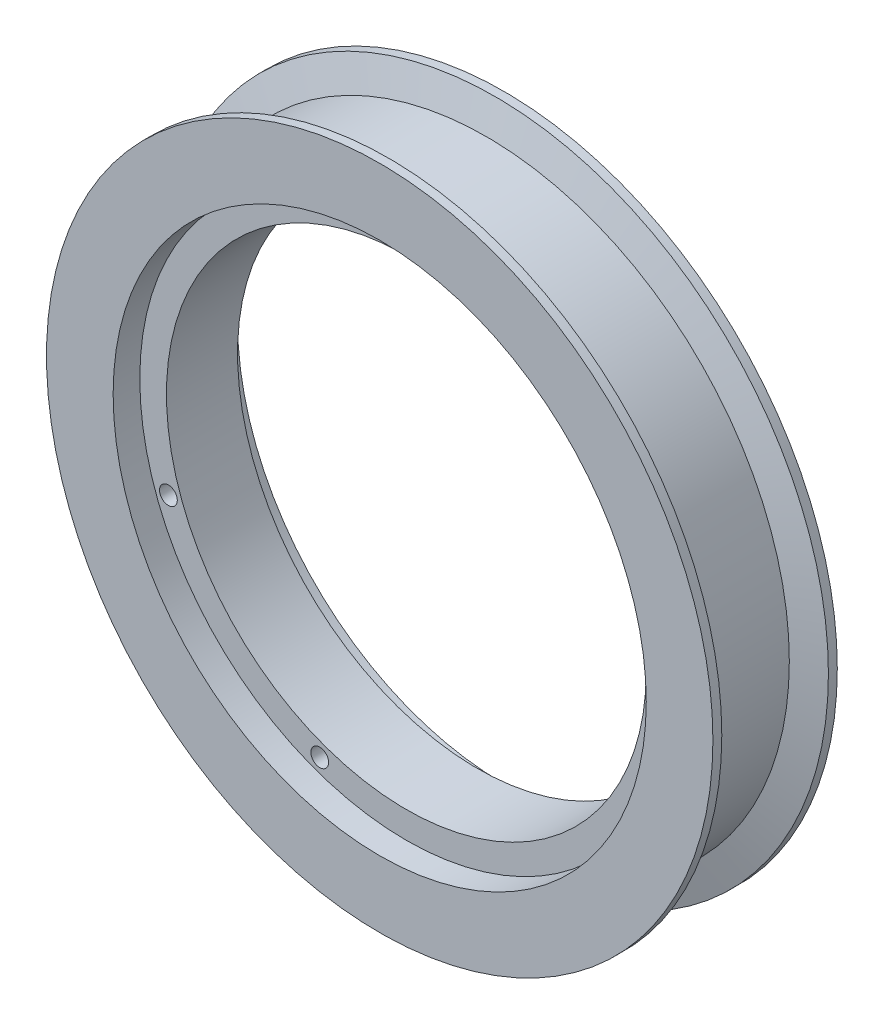
ISO-10303-21;
HEADER;
FILE_DESCRIPTION(('STEP AP214'),'2;1');
FILE_NAME('part.step','',(''),(''),'','','');
FILE_SCHEMA(('AUTOMOTIVE_DESIGN { 1 0 10303 214 1 1 1 1 }'));
ENDSEC;
DATA;
#1=APPLICATION_CONTEXT('core data for automotive mechanical design processes');
#2=APPLICATION_PROTOCOL_DEFINITION('international standard','automotive_design',2000,#1);
#3=PRODUCT_CONTEXT('',#1,'mechanical');
#4=PRODUCT('Part','Part','',(#3));
#5=PRODUCT_RELATED_PRODUCT_CATEGORY('part','',(#4));
#6=PRODUCT_DEFINITION_FORMATION('','',#4);
#7=PRODUCT_DEFINITION_CONTEXT('part definition',#1,'design');
#8=PRODUCT_DEFINITION('design','',#6,#7);
#9=PRODUCT_DEFINITION_SHAPE('','',#8);
#10=(LENGTH_UNIT() NAMED_UNIT(*) SI_UNIT(.MILLI.,.METRE.));
#11=(NAMED_UNIT(*) PLANE_ANGLE_UNIT() SI_UNIT($,.RADIAN.));
#12=(NAMED_UNIT(*) SI_UNIT($,.STERADIAN.) SOLID_ANGLE_UNIT());
#13=UNCERTAINTY_MEASURE_WITH_UNIT(LENGTH_MEASURE(1.E-05),#10,'distance_accuracy_value','');
#14=(GEOMETRIC_REPRESENTATION_CONTEXT(3) GLOBAL_UNCERTAINTY_ASSIGNED_CONTEXT((#13)) GLOBAL_UNIT_ASSIGNED_CONTEXT((#10,
#11,#12)) REPRESENTATION_CONTEXT('',''));
#15=CARTESIAN_POINT('',(0.,0.,0.));
#16=DIRECTION('',(0.,0.,1.));
#17=DIRECTION('',(1.,0.,0.));
#18=AXIS2_PLACEMENT_3D('',#15,#16,#17);
#19=CARTESIAN_POINT('',(0.,0.,25.4));
#20=DIRECTION('',(0.,0.,-1.));
#21=DIRECTION('',(-1.,0.,0.));
#22=AXIS2_PLACEMENT_3D('',#19,#20,#21);
#23=CYLINDRICAL_SURFACE('',#22,95.25);
#24=CARTESIAN_POINT('',(0.,0.,-5.08));
#25=DIRECTION('',(0.,0.,1.));
#26=DIRECTION('',(1.,0.,0.));
#27=AXIS2_PLACEMENT_3D('',#24,#25,#26);
#28=CIRCLE('',#27,95.25);
#29=CARTESIAN_POINT('',(95.25,0.,-5.08));
#30=VERTEX_POINT('',#29);
#31=EDGE_CURVE('E94',#30,#30,#28,.T.);
#32=ORIENTED_EDGE('',*,*,#31,.T.);
#33=EDGE_LOOP('',(#32));
#34=FACE_BOUND('',#33,.T.);
#35=CARTESIAN_POINT('',(0.,0.,-2.54000000000001));
#36=DIRECTION('',(0.,0.,1.));
#37=DIRECTION('',(1.,0.,0.));
#38=AXIS2_PLACEMENT_3D('',#35,#36,#37);
#39=CIRCLE('',#38,95.25);
#40=CARTESIAN_POINT('',(95.25,0.,-2.54000000000001));
#41=VERTEX_POINT('',#40);
#42=EDGE_CURVE('E111',#41,#41,#39,.T.);
#43=ORIENTED_EDGE('',*,*,#42,.F.);
#44=EDGE_LOOP('',(#43));
#45=FACE_BOUND('',#44,.T.);
#46=ADVANCED_FACE('F31',(#34,#45),#23,.T.);
#47=CARTESIAN_POINT('',(0.,0.,30.48));
#48=DIRECTION('',(0.,0.,1.));
#49=DIRECTION('',(1.,0.,0.));
#50=AXIS2_PLACEMENT_3D('',#47,#48,#49);
#51=CIRCLE('',#50,95.25);
#52=CARTESIAN_POINT('',(95.25,0.,30.48));
#53=VERTEX_POINT('',#52);
#54=EDGE_CURVE('E71',#53,#53,#51,.T.);
#55=ORIENTED_EDGE('',*,*,#54,.F.);
#56=EDGE_LOOP('',(#55));
#57=FACE_BOUND('',#56,.T.);
#58=CARTESIAN_POINT('',(0.,0.,27.94));
#59=DIRECTION('',(0.,0.,1.));
#60=DIRECTION('',(1.,0.,0.));
#61=AXIS2_PLACEMENT_3D('',#58,#59,#60);
#62=CIRCLE('',#61,95.25);
#63=CARTESIAN_POINT('',(95.25,0.,27.94));
#64=VERTEX_POINT('',#63);
#65=EDGE_CURVE('E108',#64,#64,#62,.T.);
#66=ORIENTED_EDGE('',*,*,#65,.T.);
#67=EDGE_LOOP('',(#66));
#68=FACE_BOUND('',#67,.T.);
#69=ADVANCED_FACE('F119',(#57,#68),#23,.T.);
#70=CARTESIAN_POINT('',(0.,0.,2.54));
#71=DIRECTION('',(0.,0.,1.));
#72=DIRECTION('',(1.,0.,0.));
#73=AXIS2_PLACEMENT_3D('',#70,#71,#72);
#74=PLANE('',#73);
#75=CARTESIAN_POINT('',(24.7588381753444,68.0243488186899,2.54));
#76=DIRECTION('',(0.,0.,1.));
#77=DIRECTION('',(1.,0.,0.));
#78=AXIS2_PLACEMENT_3D('',#75,#76,#77);
#79=CIRCLE('',#78,2.54000000000188);
#80=CARTESIAN_POINT('',(27.2988381753462,68.0243488186899,2.54));
#81=VERTEX_POINT('',#80);
#82=EDGE_CURVE('E58',#81,#81,#79,.F.);
#83=ORIENTED_EDGE('',*,*,#82,.F.);
#84=EDGE_LOOP('',(#83));
#85=FACE_BOUND('',#84,.T.);
#86=CARTESIAN_POINT('',(68.0243488186919,24.7588381753451,2.54));
#87=DIRECTION('',(0.,0.,1.));
#88=DIRECTION('',(1.,0.,0.));
#89=AXIS2_PLACEMENT_3D('',#86,#87,#88);
#90=CIRCLE('',#89,2.53999999999999);
#91=CARTESIAN_POINT('',(70.5643488186919,24.7588381753451,2.54));
#92=VERTEX_POINT('',#91);
#93=EDGE_CURVE('E54',#92,#92,#90,.F.);
#94=ORIENTED_EDGE('',*,*,#93,.F.);
#95=EDGE_LOOP('',(#94));
#96=FACE_BOUND('',#95,.T.);
#97=CARTESIAN_POINT('',(0.,0.,2.54));
#98=DIRECTION('',(0.,0.,1.));
#99=DIRECTION('',(1.,0.,0.));
#100=AXIS2_PLACEMENT_3D('',#97,#98,#99);
#101=CIRCLE('',#100,68.58);
#102=CARTESIAN_POINT('',(68.58,0.,2.54));
#103=VERTEX_POINT('',#102);
#104=EDGE_CURVE('E10',#103,#103,#101,.T.);
#105=ORIENTED_EDGE('',*,*,#104,.T.);
#106=EDGE_LOOP('',(#105));
#107=FACE_BOUND('',#106,.T.);
#108=CARTESIAN_POINT('',(0.,0.,2.54));
#109=DIRECTION('',(0.,0.,1.));
#110=DIRECTION('',(1.,0.,0.));
#111=AXIS2_PLACEMENT_3D('',#108,#109,#110);
#112=CIRCLE('',#111,76.2);
#113=CARTESIAN_POINT('',(76.2,0.,2.54));
#114=VERTEX_POINT('',#113);
#115=EDGE_CURVE('E39',#114,#114,#112,.T.);
#116=ORIENTED_EDGE('',*,*,#115,.F.);
#117=EDGE_LOOP('',(#116));
#118=FACE_BOUND('',#117,.T.);
#119=CARTESIAN_POINT('',(-68.0243488186905,-24.7588381753438,2.54));
#120=DIRECTION('',(0.,0.,1.));
#121=DIRECTION('',(1.,0.,0.));
#122=AXIS2_PLACEMENT_3D('',#119,#120,#121);
#123=CIRCLE('',#122,2.54000000000224);
#124=CARTESIAN_POINT('',(-65.4843488186883,-24.7588381753438,2.54));
#125=VERTEX_POINT('',#124);
#126=EDGE_CURVE('E55',#125,#125,#123,.F.);
#127=ORIENTED_EDGE('',*,*,#126,.F.);
#128=EDGE_LOOP('',(#127));
#129=FACE_BOUND('',#128,.T.);
#130=CARTESIAN_POINT('',(-24.7588381753467,-68.0243488186936,2.54));
#131=DIRECTION('',(0.,0.,1.));
#132=DIRECTION('',(1.,0.,0.));
#133=AXIS2_PLACEMENT_3D('',#130,#131,#132);
#134=CIRCLE('',#133,2.53999999999895);
#135=CARTESIAN_POINT('',(-22.2188381753478,-68.0243488186936,2.54));
#136=VERTEX_POINT('',#135);
#137=EDGE_CURVE('E61',#136,#136,#134,.F.);
#138=ORIENTED_EDGE('',*,*,#137,.F.);
#139=EDGE_LOOP('',(#138));
#140=FACE_BOUND('',#139,.T.);
#141=ADVANCED_FACE('F125',(#85,#96,#107,#118,#129,#140),#74,.F.);
#142=CARTESIAN_POINT('',(0.,0.,22.86));
#143=DIRECTION('',(0.,0.,1.));
#144=DIRECTION('',(1.,0.,0.));
#145=AXIS2_PLACEMENT_3D('',#142,#143,#144);
#146=PLANE('',#145);
#147=CARTESIAN_POINT('',(24.7588381753444,68.0243488186899,22.86));
#148=DIRECTION('',(0.,0.,1.));
#149=DIRECTION('',(1.,0.,0.));
#150=AXIS2_PLACEMENT_3D('',#147,#148,#149);
#151=CIRCLE('',#150,2.54000000000188);
#152=CARTESIAN_POINT('',(27.2988381753462,68.0243488186899,22.86));
#153=VERTEX_POINT('',#152);
#154=EDGE_CURVE('E59',#153,#153,#151,.F.);
#155=ORIENTED_EDGE('',*,*,#154,.T.);
#156=EDGE_LOOP('',(#155));
#157=FACE_BOUND('',#156,.T.);
#158=CARTESIAN_POINT('',(68.0243488186919,24.7588381753451,22.86));
#159=DIRECTION('',(0.,0.,1.));
#160=DIRECTION('',(1.,0.,0.));
#161=AXIS2_PLACEMENT_3D('',#158,#159,#160);
#162=CIRCLE('',#161,2.53999999999999);
#163=CARTESIAN_POINT('',(70.5643488186919,24.7588381753451,22.86));
#164=VERTEX_POINT('',#163);
#165=EDGE_CURVE('E51',#164,#164,#162,.F.);
#166=ORIENTED_EDGE('',*,*,#165,.T.);
#167=EDGE_LOOP('',(#166));
#168=FACE_BOUND('',#167,.T.);
#169=CARTESIAN_POINT('',(0.,0.,22.86));
#170=DIRECTION('',(0.,0.,1.));
#171=DIRECTION('',(1.,0.,0.));
#172=AXIS2_PLACEMENT_3D('',#169,#170,#171);
#173=CIRCLE('',#172,68.58);
#174=CARTESIAN_POINT('',(68.58,0.,22.86));
#175=VERTEX_POINT('',#174);
#176=EDGE_CURVE('E44',#175,#175,#173,.T.);
#177=ORIENTED_EDGE('',*,*,#176,.F.);
#178=EDGE_LOOP('',(#177));
#179=FACE_BOUND('',#178,.T.);
#180=CARTESIAN_POINT('',(0.,0.,22.86));
#181=DIRECTION('',(0.,0.,1.));
#182=DIRECTION('',(1.,0.,0.));
#183=AXIS2_PLACEMENT_3D('',#180,#181,#182);
#184=CIRCLE('',#183,76.2);
#185=CARTESIAN_POINT('',(76.2,0.,22.86));
#186=VERTEX_POINT('',#185);
#187=EDGE_CURVE('E50',#186,#186,#184,.T.);
#188=ORIENTED_EDGE('',*,*,#187,.T.);
#189=EDGE_LOOP('',(#188));
#190=FACE_BOUND('',#189,.T.);
#191=CARTESIAN_POINT('',(-68.0243488186905,-24.7588381753438,22.86));
#192=DIRECTION('',(0.,0.,1.));
#193=DIRECTION('',(1.,0.,0.));
#194=AXIS2_PLACEMENT_3D('',#191,#192,#193);
#195=CIRCLE('',#194,2.54000000000224);
#196=CARTESIAN_POINT('',(-65.4843488186883,-24.7588381753438,22.86));
#197=VERTEX_POINT('',#196);
#198=EDGE_CURVE('E56',#197,#197,#195,.F.);
#199=ORIENTED_EDGE('',*,*,#198,.T.);
#200=EDGE_LOOP('',(#199));
#201=FACE_BOUND('',#200,.T.);
#202=CARTESIAN_POINT('',(-24.7588381753467,-68.0243488186936,22.86));
#203=DIRECTION('',(0.,0.,1.));
#204=DIRECTION('',(1.,0.,0.));
#205=AXIS2_PLACEMENT_3D('',#202,#203,#204);
#206=CIRCLE('',#205,2.53999999999895);
#207=CARTESIAN_POINT('',(-22.2188381753478,-68.0243488186936,22.86));
#208=VERTEX_POINT('',#207);
#209=EDGE_CURVE('E35',#208,#208,#206,.F.);
#210=ORIENTED_EDGE('',*,*,#209,.T.);
#211=EDGE_LOOP('',(#210));
#212=FACE_BOUND('',#211,.T.);
#213=ADVANCED_FACE('F81',(#157,#168,#179,#190,#201,#212),#146,.T.);
#214=CARTESIAN_POINT('',(0.,0.,25.4));
#215=DIRECTION('',(0.,0.,-1.));
#216=DIRECTION('',(-1.,0.,0.));
#217=AXIS2_PLACEMENT_3D('',#214,#215,#216);
#218=CYLINDRICAL_SURFACE('',#217,68.58);
#219=ORIENTED_EDGE('',*,*,#104,.F.);
#220=EDGE_LOOP('',(#219));
#221=FACE_BOUND('',#220,.T.);
#222=ORIENTED_EDGE('',*,*,#176,.T.);
#223=EDGE_LOOP('',(#222));
#224=FACE_BOUND('',#223,.T.);
#225=ADVANCED_FACE('F33',(#221,#224),#218,.F.);
#226=CARTESIAN_POINT('',(0.,0.,2.54));
#227=DIRECTION('',(0.,0.,-1.));
#228=DIRECTION('',(-1.,0.,0.));
#229=AXIS2_PLACEMENT_3D('',#226,#227,#228);
#230=CYLINDRICAL_SURFACE('',#229,76.2);
#231=ORIENTED_EDGE('',*,*,#115,.T.);
#232=EDGE_LOOP('',(#231));
#233=FACE_BOUND('',#232,.T.);
#234=CARTESIAN_POINT('',(0.,0.,-5.08));
#235=DIRECTION('',(0.,0.,1.));
#236=DIRECTION('',(1.,0.,0.));
#237=AXIS2_PLACEMENT_3D('',#234,#235,#236);
#238=CIRCLE('',#237,76.2);
#239=CARTESIAN_POINT('',(76.2,0.,-5.08));
#240=VERTEX_POINT('',#239);
#241=EDGE_CURVE('E97',#240,#240,#238,.T.);
#242=ORIENTED_EDGE('',*,*,#241,.F.);
#243=EDGE_LOOP('',(#242));
#244=FACE_BOUND('',#243,.T.);
#245=ADVANCED_FACE('F88',(#233,#244),#230,.F.);
#246=CARTESIAN_POINT('',(0.,0.,22.86));
#247=DIRECTION('',(0.,0.,1.));
#248=DIRECTION('',(1.,0.,0.));
#249=AXIS2_PLACEMENT_3D('',#246,#247,#248);
#250=CYLINDRICAL_SURFACE('',#249,76.2);
#251=ORIENTED_EDGE('',*,*,#187,.F.);
#252=EDGE_LOOP('',(#251));
#253=FACE_BOUND('',#252,.T.);
#254=CARTESIAN_POINT('',(0.,0.,30.48));
#255=DIRECTION('',(0.,0.,1.));
#256=DIRECTION('',(1.,0.,0.));
#257=AXIS2_PLACEMENT_3D('',#254,#255,#256);
#258=CIRCLE('',#257,76.2);
#259=CARTESIAN_POINT('',(76.2,0.,30.48));
#260=VERTEX_POINT('',#259);
#261=EDGE_CURVE('E92',#260,#260,#258,.T.);
#262=ORIENTED_EDGE('',*,*,#261,.T.);
#263=EDGE_LOOP('',(#262));
#264=FACE_BOUND('',#263,.T.);
#265=ADVANCED_FACE('F84',(#253,#264),#250,.F.);
#266=CARTESIAN_POINT('',(68.0243488186919,24.7588381753451,25.4));
#267=DIRECTION('',(0.,0.,-1.));
#268=DIRECTION('',(-1.,0.,0.));
#269=AXIS2_PLACEMENT_3D('',#266,#267,#268);
#270=CYLINDRICAL_SURFACE('',#269,2.53999999999999);
#271=ORIENTED_EDGE('',*,*,#165,.F.);
#272=EDGE_LOOP('',(#271));
#273=FACE_BOUND('',#272,.T.);
#274=ORIENTED_EDGE('',*,*,#93,.T.);
#275=EDGE_LOOP('',(#274));
#276=FACE_BOUND('',#275,.T.);
#277=ADVANCED_FACE('F87',(#273,#276),#270,.F.);
#278=CARTESIAN_POINT('',(-68.0243488186905,-24.7588381753438,25.4));
#279=DIRECTION('',(0.,0.,-1.));
#280=DIRECTION('',(-1.,0.,0.));
#281=AXIS2_PLACEMENT_3D('',#278,#279,#280);
#282=CYLINDRICAL_SURFACE('',#281,2.54000000000224);
#283=ORIENTED_EDGE('',*,*,#198,.F.);
#284=EDGE_LOOP('',(#283));
#285=FACE_BOUND('',#284,.T.);
#286=ORIENTED_EDGE('',*,*,#126,.T.);
#287=EDGE_LOOP('',(#286));
#288=FACE_BOUND('',#287,.T.);
#289=ADVANCED_FACE('F138',(#285,#288),#282,.F.);
#290=CARTESIAN_POINT('',(24.7588381753444,68.0243488186899,25.4));
#291=DIRECTION('',(0.,0.,-1.));
#292=DIRECTION('',(-1.,0.,0.));
#293=AXIS2_PLACEMENT_3D('',#290,#291,#292);
#294=CYLINDRICAL_SURFACE('',#293,2.54000000000188);
#295=ORIENTED_EDGE('',*,*,#154,.F.);
#296=EDGE_LOOP('',(#295));
#297=FACE_BOUND('',#296,.T.);
#298=ORIENTED_EDGE('',*,*,#82,.T.);
#299=EDGE_LOOP('',(#298));
#300=FACE_BOUND('',#299,.T.);
#301=ADVANCED_FACE('F134',(#297,#300),#294,.F.);
#302=CARTESIAN_POINT('',(-24.7588381753467,-68.0243488186936,25.4));
#303=DIRECTION('',(0.,0.,-1.));
#304=DIRECTION('',(-1.,0.,0.));
#305=AXIS2_PLACEMENT_3D('',#302,#303,#304);
#306=CYLINDRICAL_SURFACE('',#305,2.53999999999895);
#307=ORIENTED_EDGE('',*,*,#209,.F.);
#308=EDGE_LOOP('',(#307));
#309=FACE_BOUND('',#308,.T.);
#310=ORIENTED_EDGE('',*,*,#137,.T.);
#311=EDGE_LOOP('',(#310));
#312=FACE_BOUND('',#311,.T.);
#313=ADVANCED_FACE('F131',(#309,#312),#306,.F.);
#314=CARTESIAN_POINT('',(0.,0.,30.48));
#315=DIRECTION('',(0.,0.,1.));
#316=DIRECTION('',(1.,0.,0.));
#317=AXIS2_PLACEMENT_3D('',#314,#315,#316);
#318=PLANE('',#317);
#319=ORIENTED_EDGE('',*,*,#54,.T.);
#320=EDGE_LOOP('',(#319));
#321=FACE_BOUND('',#320,.T.);
#322=ORIENTED_EDGE('',*,*,#261,.F.);
#323=EDGE_LOOP('',(#322));
#324=FACE_BOUND('',#323,.T.);
#325=ADVANCED_FACE('F129',(#321,#324),#318,.T.);
#326=CARTESIAN_POINT('',(0.,0.,-5.08));
#327=DIRECTION('',(0.,0.,-1.));
#328=DIRECTION('',(1.,0.,0.));
#329=AXIS2_PLACEMENT_3D('',#326,#327,#328);
#330=PLANE('',#329);
#331=ORIENTED_EDGE('',*,*,#241,.T.);
#332=EDGE_LOOP('',(#331));
#333=FACE_BOUND('',#332,.T.);
#334=ORIENTED_EDGE('',*,*,#31,.F.);
#335=EDGE_LOOP('',(#334));
#336=FACE_BOUND('',#335,.T.);
#337=ADVANCED_FACE('F160',(#333,#336),#330,.T.);
#338=CARTESIAN_POINT('',(0.,0.,0.));
#339=DIRECTION('',(0.,0.,-1.));
#340=DIRECTION('',(-1.,0.,0.));
#341=AXIS2_PLACEMENT_3D('',#338,#339,#340);
#342=CONICAL_SURFACE('',#341,86.614,1.28474488507758);
#343=ORIENTED_EDGE('',*,*,#42,.T.);
#344=EDGE_LOOP('',(#343));
#345=FACE_BOUND('',#344,.T.);
#346=CARTESIAN_POINT('',(0.,0.,0.));
#347=DIRECTION('',(0.,0.,1.));
#348=DIRECTION('',(1.,0.,0.));
#349=AXIS2_PLACEMENT_3D('',#346,#347,#348);
#350=CIRCLE('',#349,86.614);
#351=CARTESIAN_POINT('',(86.614,0.,0.));
#352=VERTEX_POINT('',#351);
#353=EDGE_CURVE('E102',#352,#352,#350,.T.);
#354=ORIENTED_EDGE('',*,*,#353,.F.);
#355=EDGE_LOOP('',(#354));
#356=FACE_BOUND('',#355,.T.);
#357=ADVANCED_FACE('F115',(#345,#356),#342,.T.);
#358=CARTESIAN_POINT('',(0.,0.,22.86));
#359=DIRECTION('',(0.,0.,1.));
#360=DIRECTION('',(1.,0.,0.));
#361=AXIS2_PLACEMENT_3D('',#358,#359,#360);
#362=CYLINDRICAL_SURFACE('',#361,86.614);
#363=ORIENTED_EDGE('',*,*,#353,.T.);
#364=EDGE_LOOP('',(#363));
#365=FACE_BOUND('',#364,.T.);
#366=CARTESIAN_POINT('',(0.,0.,25.4));
#367=DIRECTION('',(0.,0.,1.));
#368=DIRECTION('',(1.,0.,0.));
#369=AXIS2_PLACEMENT_3D('',#366,#367,#368);
#370=CIRCLE('',#369,86.614);
#371=CARTESIAN_POINT('',(86.614,0.,25.4));
#372=VERTEX_POINT('',#371);
#373=EDGE_CURVE('E105',#372,#372,#370,.T.);
#374=ORIENTED_EDGE('',*,*,#373,.F.);
#375=EDGE_LOOP('',(#374));
#376=FACE_BOUND('',#375,.T.);
#377=ADVANCED_FACE('F168',(#365,#376),#362,.T.);
#378=CARTESIAN_POINT('',(0.,0.,27.94));
#379=DIRECTION('',(0.,0.,1.));
#380=DIRECTION('',(1.,0.,0.));
#381=AXIS2_PLACEMENT_3D('',#378,#379,#380);
#382=CONICAL_SURFACE('',#381,95.25,1.28474488507758);
#383=ORIENTED_EDGE('',*,*,#373,.T.);
#384=EDGE_LOOP('',(#383));
#385=FACE_BOUND('',#384,.T.);
#386=ORIENTED_EDGE('',*,*,#65,.F.);
#387=EDGE_LOOP('',(#386));
#388=FACE_BOUND('',#387,.T.);
#389=ADVANCED_FACE('F174',(#385,#388),#382,.T.);
#390=CLOSED_SHELL('',(#46,#69,#141,#213,#225,#245,#265,#277,#289,#301,#313,#325,#337,#357,#377,#389));
#391=MANIFOLD_SOLID_BREP('B2',#390);
#392=ADVANCED_BREP_SHAPE_REPRESENTATION('',(#18,#391),#14);
#393=SHAPE_DEFINITION_REPRESENTATION(#9,#392);
ENDSEC;
END-ISO-10303-21;
